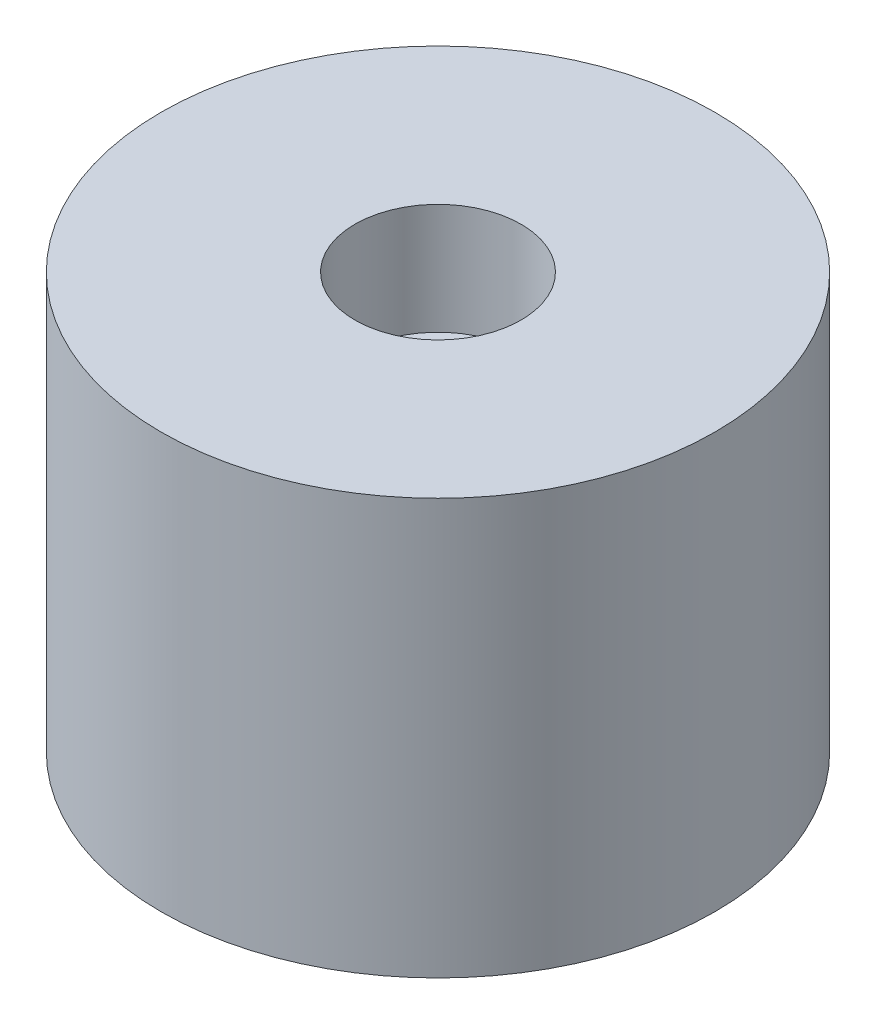
ISO-10303-21;
HEADER;
FILE_DESCRIPTION(('STEP AP214'),'2;1');
FILE_NAME('part.step','',(''),(''),'','','');
FILE_SCHEMA(('AUTOMOTIVE_DESIGN { 1 0 10303 214 1 1 1 1 }'));
ENDSEC;
DATA;
#1=APPLICATION_CONTEXT('core data for automotive mechanical design processes');
#2=APPLICATION_PROTOCOL_DEFINITION('international standard','automotive_design',2000,#1);
#3=PRODUCT_CONTEXT('',#1,'mechanical');
#4=PRODUCT('Part','Part','',(#3));
#5=PRODUCT_RELATED_PRODUCT_CATEGORY('part','',(#4));
#6=PRODUCT_DEFINITION_FORMATION('','',#4);
#7=PRODUCT_DEFINITION_CONTEXT('part definition',#1,'design');
#8=PRODUCT_DEFINITION('design','',#6,#7);
#9=PRODUCT_DEFINITION_SHAPE('','',#8);
#10=(LENGTH_UNIT() NAMED_UNIT(*) SI_UNIT(.MILLI.,.METRE.));
#11=(NAMED_UNIT(*) PLANE_ANGLE_UNIT() SI_UNIT($,.RADIAN.));
#12=(NAMED_UNIT(*) SI_UNIT($,.STERADIAN.) SOLID_ANGLE_UNIT());
#13=UNCERTAINTY_MEASURE_WITH_UNIT(LENGTH_MEASURE(1.E-05),#10,'distance_accuracy_value','');
#14=(GEOMETRIC_REPRESENTATION_CONTEXT(3) GLOBAL_UNCERTAINTY_ASSIGNED_CONTEXT((#13)) GLOBAL_UNIT_ASSIGNED_CONTEXT((#10,
#11,#12)) REPRESENTATION_CONTEXT('',''));
#15=CARTESIAN_POINT('',(0.,0.,0.));
#16=DIRECTION('',(0.,0.,1.));
#17=DIRECTION('',(1.,0.,0.));
#18=AXIS2_PLACEMENT_3D('',#15,#16,#17);
#19=CARTESIAN_POINT('',(0.,-3.5,0.));
#20=DIRECTION('',(0.,-1.,0.));
#21=DIRECTION('',(1.,0.,0.));
#22=AXIS2_PLACEMENT_3D('',#19,#20,#21);
#23=PLANE('',#22);
#24=CARTESIAN_POINT('',(0.,-3.5,0.));
#25=DIRECTION('',(0.,1.,0.));
#26=DIRECTION('',(-1.,0.,0.));
#27=AXIS2_PLACEMENT_3D('',#24,#25,#26);
#28=CIRCLE('',#27,3.);
#29=CARTESIAN_POINT('',(-3.,-3.5,0.));
#30=VERTEX_POINT('',#29);
#31=EDGE_CURVE('E10',#30,#30,#28,.T.);
#32=ORIENTED_EDGE('',*,*,#31,.F.);
#33=EDGE_LOOP('',(#32));
#34=FACE_BOUND('',#33,.T.);
#35=ADVANCED_FACE('F39',(#34),#23,.T.);
#36=CARTESIAN_POINT('',(0.,3.5,0.));
#37=DIRECTION('',(0.,1.,0.));
#38=DIRECTION('',(-1.,0.,0.));
#39=AXIS2_PLACEMENT_3D('',#36,#37,#38);
#40=CYLINDRICAL_SURFACE('',#39,3.);
#41=ORIENTED_EDGE('',*,*,#31,.T.);
#42=EDGE_LOOP('',(#41));
#43=FACE_BOUND('',#42,.T.);
#44=CARTESIAN_POINT('',(0.,-7.5,0.));
#45=DIRECTION('',(0.,1.,0.));
#46=DIRECTION('',(-1.,0.,0.));
#47=AXIS2_PLACEMENT_3D('',#44,#45,#46);
#48=CIRCLE('',#47,3.);
#49=CARTESIAN_POINT('',(-3.,-7.5,0.));
#50=VERTEX_POINT('',#49);
#51=EDGE_CURVE('E46',#50,#50,#48,.T.);
#52=ORIENTED_EDGE('',*,*,#51,.F.);
#53=EDGE_LOOP('',(#52));
#54=FACE_BOUND('',#53,.T.);
#55=ADVANCED_FACE('F93',(#43,#54),#40,.F.);
#56=CARTESIAN_POINT('',(0.,-7.5,0.));
#57=DIRECTION('',(0.,-1.,0.));
#58=DIRECTION('',(1.,0.,0.));
#59=AXIS2_PLACEMENT_3D('',#56,#57,#58);
#60=PLANE('',#59);
#61=ORIENTED_EDGE('',*,*,#51,.T.);
#62=EDGE_LOOP('',(#61));
#63=FACE_BOUND('',#62,.T.);
#64=CARTESIAN_POINT('',(0.,-7.5,0.));
#65=DIRECTION('',(0.,1.,0.));
#66=DIRECTION('',(-1.,0.,0.));
#67=AXIS2_PLACEMENT_3D('',#64,#65,#66);
#68=CIRCLE('',#67,10.);
#69=CARTESIAN_POINT('',(-10.,-7.5,0.));
#70=VERTEX_POINT('',#69);
#71=EDGE_CURVE('E51',#70,#70,#68,.T.);
#72=ORIENTED_EDGE('',*,*,#71,.F.);
#73=EDGE_LOOP('',(#72));
#74=FACE_BOUND('',#73,.T.);
#75=ADVANCED_FACE('F88',(#63,#74),#60,.T.);
#76=CARTESIAN_POINT('',(0.,3.5,0.));
#77=DIRECTION('',(0.,1.,0.));
#78=DIRECTION('',(-1.,0.,0.));
#79=AXIS2_PLACEMENT_3D('',#76,#77,#78);
#80=CYLINDRICAL_SURFACE('',#79,10.);
#81=CARTESIAN_POINT('',(0.,7.5,0.));
#82=DIRECTION('',(0.,1.,0.));
#83=DIRECTION('',(-1.,0.,0.));
#84=AXIS2_PLACEMENT_3D('',#81,#82,#83);
#85=CIRCLE('',#84,10.);
#86=CARTESIAN_POINT('',(-10.,7.5,0.));
#87=VERTEX_POINT('',#86);
#88=EDGE_CURVE('E56',#87,#87,#85,.T.);
#89=ORIENTED_EDGE('',*,*,#88,.F.);
#90=EDGE_LOOP('',(#89));
#91=FACE_BOUND('',#90,.T.);
#92=ORIENTED_EDGE('',*,*,#71,.T.);
#93=EDGE_LOOP('',(#92));
#94=FACE_BOUND('',#93,.T.);
#95=ADVANCED_FACE('F82',(#91,#94),#80,.T.);
#96=CARTESIAN_POINT('',(0.,7.5,0.));
#97=DIRECTION('',(0.,-1.,0.));
#98=DIRECTION('',(1.,0.,0.));
#99=AXIS2_PLACEMENT_3D('',#96,#97,#98);
#100=PLANE('',#99);
#101=CARTESIAN_POINT('',(0.,7.5,0.));
#102=DIRECTION('',(0.,1.,0.));
#103=DIRECTION('',(-1.,0.,0.));
#104=AXIS2_PLACEMENT_3D('',#101,#102,#103);
#105=CIRCLE('',#104,3.);
#106=CARTESIAN_POINT('',(-3.,7.5,0.));
#107=VERTEX_POINT('',#106);
#108=EDGE_CURVE('E62',#107,#107,#105,.T.);
#109=ORIENTED_EDGE('',*,*,#108,.F.);
#110=EDGE_LOOP('',(#109));
#111=FACE_BOUND('',#110,.T.);
#112=ORIENTED_EDGE('',*,*,#88,.T.);
#113=EDGE_LOOP('',(#112));
#114=FACE_BOUND('',#113,.T.);
#115=ADVANCED_FACE('F76',(#111,#114),#100,.F.);
#116=CARTESIAN_POINT('',(0.,3.5,0.));
#117=DIRECTION('',(0.,1.,0.));
#118=DIRECTION('',(-1.,0.,0.));
#119=AXIS2_PLACEMENT_3D('',#116,#117,#118);
#120=CYLINDRICAL_SURFACE('',#119,3.);
#121=CARTESIAN_POINT('',(0.,3.5,0.));
#122=DIRECTION('',(0.,1.,0.));
#123=DIRECTION('',(-1.,0.,0.));
#124=AXIS2_PLACEMENT_3D('',#121,#122,#123);
#125=CIRCLE('',#124,3.);
#126=CARTESIAN_POINT('',(-3.,3.5,0.));
#127=VERTEX_POINT('',#126);
#128=EDGE_CURVE('E66',#127,#127,#125,.T.);
#129=ORIENTED_EDGE('',*,*,#128,.F.);
#130=EDGE_LOOP('',(#129));
#131=FACE_BOUND('',#130,.T.);
#132=ORIENTED_EDGE('',*,*,#108,.T.);
#133=EDGE_LOOP('',(#132));
#134=FACE_BOUND('',#133,.T.);
#135=ADVANCED_FACE('F73',(#131,#134),#120,.F.);
#136=CARTESIAN_POINT('',(0.,3.5,0.));
#137=DIRECTION('',(0.,-1.,0.));
#138=DIRECTION('',(1.,0.,0.));
#139=AXIS2_PLACEMENT_3D('',#136,#137,#138);
#140=PLANE('',#139);
#141=ORIENTED_EDGE('',*,*,#128,.T.);
#142=EDGE_LOOP('',(#141));
#143=FACE_BOUND('',#142,.T.);
#144=ADVANCED_FACE('F71',(#143),#140,.F.);
#145=CLOSED_SHELL('',(#35,#55,#75,#95,#115,#135,#144));
#146=MANIFOLD_SOLID_BREP('B2',#145);
#147=ADVANCED_BREP_SHAPE_REPRESENTATION('',(#18,#146),#14);
#148=SHAPE_DEFINITION_REPRESENTATION(#9,#147);
ENDSEC;
END-ISO-10303-21;
